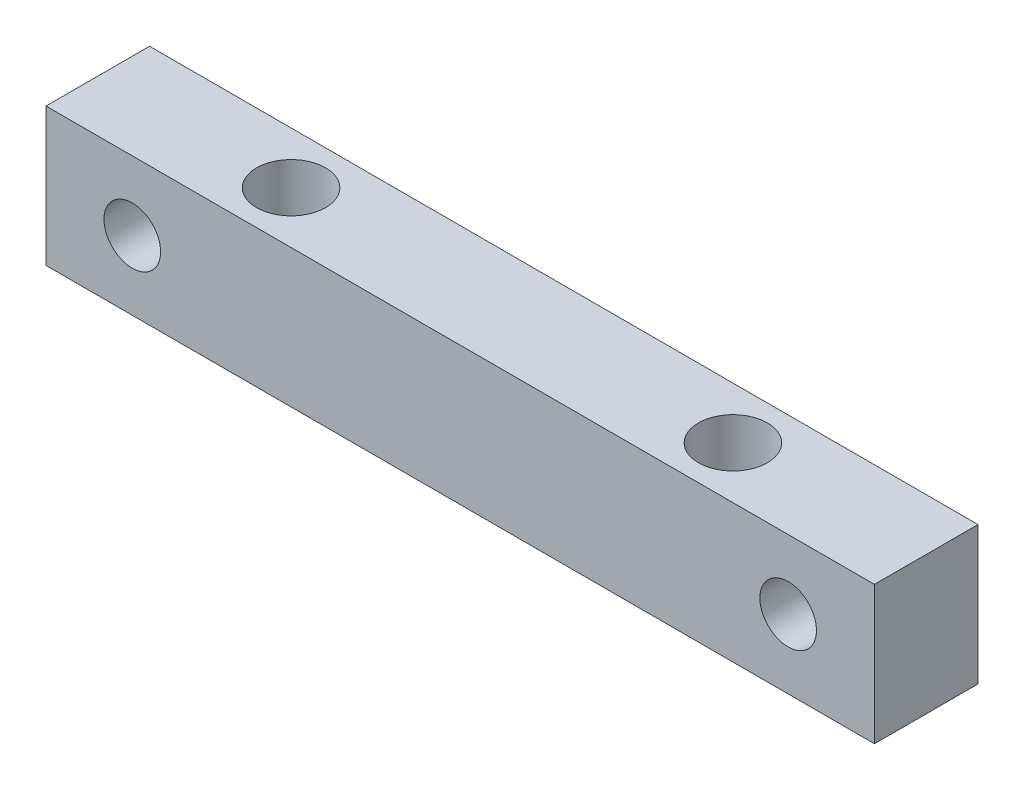
ISO-10303-21;
HEADER;
FILE_DESCRIPTION(('STEP AP214'),'2;1');
FILE_NAME('part.step','',(''),(''),'','','');
FILE_SCHEMA(('AUTOMOTIVE_DESIGN { 1 0 10303 214 1 1 1 1 }'));
ENDSEC;
DATA;
#1=APPLICATION_CONTEXT('core data for automotive mechanical design processes');
#2=APPLICATION_PROTOCOL_DEFINITION('international standard','automotive_design',2000,#1);
#3=PRODUCT_CONTEXT('',#1,'mechanical');
#4=PRODUCT('Part','Part','',(#3));
#5=PRODUCT_RELATED_PRODUCT_CATEGORY('part','',(#4));
#6=PRODUCT_DEFINITION_FORMATION('','',#4);
#7=PRODUCT_DEFINITION_CONTEXT('part definition',#1,'design');
#8=PRODUCT_DEFINITION('design','',#6,#7);
#9=PRODUCT_DEFINITION_SHAPE('','',#8);
#10=(LENGTH_UNIT() NAMED_UNIT(*) SI_UNIT(.MILLI.,.METRE.));
#11=(NAMED_UNIT(*) PLANE_ANGLE_UNIT() SI_UNIT($,.RADIAN.));
#12=(NAMED_UNIT(*) SI_UNIT($,.STERADIAN.) SOLID_ANGLE_UNIT());
#13=UNCERTAINTY_MEASURE_WITH_UNIT(LENGTH_MEASURE(1.E-05),#10,'distance_accuracy_value','');
#14=(GEOMETRIC_REPRESENTATION_CONTEXT(3) GLOBAL_UNCERTAINTY_ASSIGNED_CONTEXT((#13)) GLOBAL_UNIT_ASSIGNED_CONTEXT((#10,
#11,#12)) REPRESENTATION_CONTEXT('',''));
#15=CARTESIAN_POINT('',(0.,0.,0.));
#16=DIRECTION('',(0.,0.,1.));
#17=DIRECTION('',(1.,0.,0.));
#18=AXIS2_PLACEMENT_3D('',#15,#16,#17);
#19=CARTESIAN_POINT('',(0.,800.856140975981,0.));
#20=DIRECTION('',(0.,1.,0.));
#21=DIRECTION('',(0.,0.,1.));
#22=AXIS2_PLACEMENT_3D('',#19,#20,#21);
#23=PLANE('',#22);
#24=CARTESIAN_POINT('',(-20.3200000000132,800.856140975981,-58.7375));
#25=DIRECTION('',(0.,1.,0.));
#26=DIRECTION('',(0.,0.,1.));
#27=AXIS2_PLACEMENT_3D('',#24,#25,#26);
#28=CIRCLE('',#27,3.175);
#29=CARTESIAN_POINT('',(-20.3200000000132,800.856140975981,-55.5625));
#30=VERTEX_POINT('',#29);
#31=EDGE_CURVE('E100',#30,#30,#28,.T.);
#32=ORIENTED_EDGE('',*,*,#31,.F.);
#33=EDGE_LOOP('',(#32));
#34=FACE_BOUND('',#33,.T.);
#35=DIRECTION('',(0.,0.,1.));
#36=VECTOR('',#35,1.);
#37=CARTESIAN_POINT('',(-38.1000000000132,800.856140975981,-63.5));
#38=LINE('',#37,#36);
#39=CARTESIAN_POINT('',(-38.1000000000132,800.856140975981,-63.5));
#40=VERTEX_POINT('',#39);
#41=CARTESIAN_POINT('',(-38.1000000000132,800.856140975981,-53.975));
#42=VERTEX_POINT('',#41);
#43=EDGE_CURVE('E85',#40,#42,#38,.T.);
#44=ORIENTED_EDGE('',*,*,#43,.T.);
#45=DIRECTION('',(1.,0.,0.));
#46=VECTOR('',#45,1.);
#47=CARTESIAN_POINT('',(-38.1000000000132,800.856140975981,-53.975));
#48=LINE('',#47,#46);
#49=CARTESIAN_POINT('',(38.0999999999868,800.856140975981,-53.975));
#50=VERTEX_POINT('',#49);
#51=EDGE_CURVE('E80',#42,#50,#48,.T.);
#52=ORIENTED_EDGE('',*,*,#51,.T.);
#53=DIRECTION('',(0.,0.,-1.));
#54=VECTOR('',#53,1.);
#55=CARTESIAN_POINT('',(38.0999999999868,800.856140975981,-63.5));
#56=LINE('',#55,#54);
#57=CARTESIAN_POINT('',(38.0999999999868,800.856140975981,-63.5));
#58=VERTEX_POINT('',#57);
#59=EDGE_CURVE('E83',#50,#58,#56,.T.);
#60=ORIENTED_EDGE('',*,*,#59,.T.);
#61=DIRECTION('',(-1.,0.,0.));
#62=VECTOR('',#61,1.);
#63=CARTESIAN_POINT('',(-38.1000000000132,800.856140975981,-63.5));
#64=LINE('',#63,#62);
#65=EDGE_CURVE('E50',#58,#40,#64,.T.);
#66=ORIENTED_EDGE('',*,*,#65,.T.);
#67=EDGE_LOOP('',(#44,#52,#60,#66));
#68=FACE_BOUND('',#67,.T.);
#69=CARTESIAN_POINT('',(20.3199999999868,800.856140975981,-58.7375));
#70=DIRECTION('',(0.,1.,0.));
#71=DIRECTION('',(0.,0.,-1.));
#72=AXIS2_PLACEMENT_3D('',#69,#70,#71);
#73=CIRCLE('',#72,3.175);
#74=CARTESIAN_POINT('',(20.3199999999868,800.856140975981,-61.9125));
#75=VERTEX_POINT('',#74);
#76=EDGE_CURVE('E115',#75,#75,#73,.T.);
#77=ORIENTED_EDGE('',*,*,#76,.F.);
#78=EDGE_LOOP('',(#77));
#79=FACE_BOUND('',#78,.T.);
#80=ADVANCED_FACE('F33',(#34,#68,#79),#23,.T.);
#81=CARTESIAN_POINT('',(0.,788.156140975981,0.));
#82=DIRECTION('',(0.,1.,0.));
#83=DIRECTION('',(0.,0.,1.));
#84=AXIS2_PLACEMENT_3D('',#81,#82,#83);
#85=PLANE('',#84);
#86=DIRECTION('',(0.,0.,1.));
#87=VECTOR('',#86,1.);
#88=CARTESIAN_POINT('',(-38.1000000000132,788.156140975981,-63.5));
#89=LINE('',#88,#87);
#90=CARTESIAN_POINT('',(-38.1000000000132,788.156140975981,-63.5));
#91=VERTEX_POINT('',#90);
#92=CARTESIAN_POINT('',(-38.1000000000132,788.156140975981,-53.975));
#93=VERTEX_POINT('',#92);
#94=EDGE_CURVE('E97',#91,#93,#89,.T.);
#95=ORIENTED_EDGE('',*,*,#94,.F.);
#96=DIRECTION('',(-1.,0.,0.));
#97=VECTOR('',#96,1.);
#98=CARTESIAN_POINT('',(-38.1000000000132,788.156140975981,-63.5));
#99=LINE('',#98,#97);
#100=CARTESIAN_POINT('',(38.0999999999868,788.156140975981,-63.5));
#101=VERTEX_POINT('',#100);
#102=EDGE_CURVE('E73',#101,#91,#99,.T.);
#103=ORIENTED_EDGE('',*,*,#102,.F.);
#104=DIRECTION('',(0.,0.,-1.));
#105=VECTOR('',#104,1.);
#106=CARTESIAN_POINT('',(38.0999999999868,788.156140975981,-63.5));
#107=LINE('',#106,#105);
#108=CARTESIAN_POINT('',(38.0999999999868,788.156140975981,-53.975));
#109=VERTEX_POINT('',#108);
#110=EDGE_CURVE('E67',#109,#101,#107,.T.);
#111=ORIENTED_EDGE('',*,*,#110,.F.);
#112=DIRECTION('',(1.,0.,0.));
#113=VECTOR('',#112,1.);
#114=CARTESIAN_POINT('',(-38.1000000000132,788.156140975981,-53.975));
#115=LINE('',#114,#113);
#116=EDGE_CURVE('E89',#93,#109,#115,.T.);
#117=ORIENTED_EDGE('',*,*,#116,.F.);
#118=EDGE_LOOP('',(#95,#103,#111,#117));
#119=FACE_BOUND('',#118,.T.);
#120=CARTESIAN_POINT('',(-20.3200000000132,788.156140975981,-58.7375));
#121=DIRECTION('',(0.,1.,0.));
#122=DIRECTION('',(0.,0.,1.));
#123=AXIS2_PLACEMENT_3D('',#120,#121,#122);
#124=CIRCLE('',#123,3.175);
#125=CARTESIAN_POINT('',(-20.3200000000132,788.156140975981,-55.5625));
#126=VERTEX_POINT('',#125);
#127=EDGE_CURVE('E112',#126,#126,#124,.T.);
#128=ORIENTED_EDGE('',*,*,#127,.T.);
#129=EDGE_LOOP('',(#128));
#130=FACE_BOUND('',#129,.T.);
#131=CARTESIAN_POINT('',(20.3199999999868,788.156140975981,-58.7375));
#132=DIRECTION('',(0.,1.,0.));
#133=DIRECTION('',(0.,0.,-1.));
#134=AXIS2_PLACEMENT_3D('',#131,#132,#133);
#135=CIRCLE('',#134,3.175);
#136=CARTESIAN_POINT('',(20.3199999999868,788.156140975981,-61.9125));
#137=VERTEX_POINT('',#136);
#138=EDGE_CURVE('E118',#137,#137,#135,.T.);
#139=ORIENTED_EDGE('',*,*,#138,.T.);
#140=EDGE_LOOP('',(#139));
#141=FACE_BOUND('',#140,.T.);
#142=ADVANCED_FACE('F108',(#119,#130,#141),#85,.F.);
#143=CARTESIAN_POINT('',(-38.1000000000132,800.856140975981,-63.5));
#144=DIRECTION('',(1.,0.,0.));
#145=DIRECTION('',(0.,0.,-1.));
#146=AXIS2_PLACEMENT_3D('',#143,#144,#145);
#147=PLANE('',#146);
#148=ORIENTED_EDGE('',*,*,#94,.T.);
#149=DIRECTION('',(0.,-1.,0.));
#150=VECTOR('',#149,1.);
#151=CARTESIAN_POINT('',(-38.1000000000132,800.856140975981,-53.975));
#152=LINE('',#151,#150);
#153=EDGE_CURVE('E11',#42,#93,#152,.T.);
#154=ORIENTED_EDGE('',*,*,#153,.F.);
#155=ORIENTED_EDGE('',*,*,#43,.F.);
#156=DIRECTION('',(0.,-1.,0.));
#157=VECTOR('',#156,1.);
#158=CARTESIAN_POINT('',(-38.1000000000132,800.856140975981,-63.5));
#159=LINE('',#158,#157);
#160=EDGE_CURVE('E93',#40,#91,#159,.T.);
#161=ORIENTED_EDGE('',*,*,#160,.T.);
#162=EDGE_LOOP('',(#148,#154,#155,#161));
#163=FACE_BOUND('',#162,.T.);
#164=ADVANCED_FACE('F35',(#163),#147,.F.);
#165=CARTESIAN_POINT('',(-38.1000000000132,800.856140975981,-53.975));
#166=DIRECTION('',(0.,0.,-1.));
#167=DIRECTION('',(-1.,0.,0.));
#168=AXIS2_PLACEMENT_3D('',#165,#166,#167);
#169=PLANE('',#168);
#170=CARTESIAN_POINT('',(-30.1624999999868,794.506140975981,-53.975));
#171=DIRECTION('',(0.,0.,-1.));
#172=DIRECTION('',(-1.,0.,0.));
#173=AXIS2_PLACEMENT_3D('',#170,#171,#172);
#174=CIRCLE('',#173,2.60350000000001);
#175=CARTESIAN_POINT('',(-32.7659999999868,794.506140975981,-53.975));
#176=VERTEX_POINT('',#175);
#177=EDGE_CURVE('E121',#176,#176,#174,.F.);
#178=ORIENTED_EDGE('',*,*,#177,.F.);
#179=EDGE_LOOP('',(#178));
#180=FACE_BOUND('',#179,.T.);
#181=CARTESIAN_POINT('',(30.1624999999868,794.506140975981,-53.975));
#182=DIRECTION('',(0.,0.,-1.));
#183=DIRECTION('',(-1.,0.,0.));
#184=AXIS2_PLACEMENT_3D('',#181,#182,#183);
#185=CIRCLE('',#184,2.60350000000001);
#186=CARTESIAN_POINT('',(27.5589999999867,794.506140975981,-53.975));
#187=VERTEX_POINT('',#186);
#188=EDGE_CURVE('E124',#187,#187,#185,.F.);
#189=ORIENTED_EDGE('',*,*,#188,.F.);
#190=EDGE_LOOP('',(#189));
#191=FACE_BOUND('',#190,.T.);
#192=ORIENTED_EDGE('',*,*,#116,.T.);
#193=DIRECTION('',(0.,-1.,0.));
#194=VECTOR('',#193,1.);
#195=CARTESIAN_POINT('',(38.0999999999868,800.856140975981,-53.975));
#196=LINE('',#195,#194);
#197=EDGE_CURVE('E42',#50,#109,#196,.T.);
#198=ORIENTED_EDGE('',*,*,#197,.F.);
#199=ORIENTED_EDGE('',*,*,#51,.F.);
#200=ORIENTED_EDGE('',*,*,#153,.T.);
#201=EDGE_LOOP('',(#192,#198,#199,#200));
#202=FACE_BOUND('',#201,.T.);
#203=ADVANCED_FACE('F88',(#180,#191,#202),#169,.F.);
#204=CARTESIAN_POINT('',(38.0999999999868,800.856140975981,-63.5));
#205=DIRECTION('',(-1.,0.,0.));
#206=DIRECTION('',(0.,0.,1.));
#207=AXIS2_PLACEMENT_3D('',#204,#205,#206);
#208=PLANE('',#207);
#209=ORIENTED_EDGE('',*,*,#110,.T.);
#210=DIRECTION('',(0.,-1.,0.));
#211=VECTOR('',#210,1.);
#212=CARTESIAN_POINT('',(38.0999999999868,800.856140975981,-63.5));
#213=LINE('',#212,#211);
#214=EDGE_CURVE('E90',#58,#101,#213,.T.);
#215=ORIENTED_EDGE('',*,*,#214,.F.);
#216=ORIENTED_EDGE('',*,*,#59,.F.);
#217=ORIENTED_EDGE('',*,*,#197,.T.);
#218=EDGE_LOOP('',(#209,#215,#216,#217));
#219=FACE_BOUND('',#218,.T.);
#220=ADVANCED_FACE('F91',(#219),#208,.F.);
#221=CARTESIAN_POINT('',(-38.1000000000132,800.856140975981,-63.5));
#222=DIRECTION('',(0.,0.,1.));
#223=DIRECTION('',(1.,0.,0.));
#224=AXIS2_PLACEMENT_3D('',#221,#222,#223);
#225=PLANE('',#224);
#226=CARTESIAN_POINT('',(-30.1624999999868,794.506140975981,-63.5));
#227=DIRECTION('',(0.,0.,-1.));
#228=DIRECTION('',(-1.,0.,0.));
#229=AXIS2_PLACEMENT_3D('',#226,#227,#228);
#230=CIRCLE('',#229,2.60350000000001);
#231=CARTESIAN_POINT('',(-32.7659999999868,794.506140975981,-63.5));
#232=VERTEX_POINT('',#231);
#233=EDGE_CURVE('E127',#232,#232,#230,.T.);
#234=ORIENTED_EDGE('',*,*,#233,.F.);
#235=EDGE_LOOP('',(#234));
#236=FACE_BOUND('',#235,.T.);
#237=CARTESIAN_POINT('',(30.1624999999868,794.506140975981,-63.5));
#238=DIRECTION('',(0.,0.,-1.));
#239=DIRECTION('',(-1.,0.,0.));
#240=AXIS2_PLACEMENT_3D('',#237,#238,#239);
#241=CIRCLE('',#240,2.60350000000001);
#242=CARTESIAN_POINT('',(27.5589999999867,794.506140975981,-63.5));
#243=VERTEX_POINT('',#242);
#244=EDGE_CURVE('E128',#243,#243,#241,.T.);
#245=ORIENTED_EDGE('',*,*,#244,.F.);
#246=EDGE_LOOP('',(#245));
#247=FACE_BOUND('',#246,.T.);
#248=ORIENTED_EDGE('',*,*,#102,.T.);
#249=ORIENTED_EDGE('',*,*,#160,.F.);
#250=ORIENTED_EDGE('',*,*,#65,.F.);
#251=ORIENTED_EDGE('',*,*,#214,.T.);
#252=EDGE_LOOP('',(#248,#249,#250,#251));
#253=FACE_BOUND('',#252,.T.);
#254=ADVANCED_FACE('F105',(#236,#247,#253),#225,.F.);
#255=CARTESIAN_POINT('',(-20.3200000000132,800.856140975981,-58.7375));
#256=DIRECTION('',(0.,-1.,0.));
#257=DIRECTION('',(0.,0.,-1.));
#258=AXIS2_PLACEMENT_3D('',#255,#256,#257);
#259=CYLINDRICAL_SURFACE('',#258,3.175);
#260=ORIENTED_EDGE('',*,*,#31,.T.);
#261=EDGE_LOOP('',(#260));
#262=FACE_BOUND('',#261,.T.);
#263=ORIENTED_EDGE('',*,*,#127,.F.);
#264=EDGE_LOOP('',(#263));
#265=FACE_BOUND('',#264,.T.);
#266=ADVANCED_FACE('F141',(#262,#265),#259,.F.);
#267=CARTESIAN_POINT('',(20.3199999999868,800.856140975981,-58.7375));
#268=DIRECTION('',(0.,-1.,0.));
#269=DIRECTION('',(0.,0.,-1.));
#270=AXIS2_PLACEMENT_3D('',#267,#268,#269);
#271=CYLINDRICAL_SURFACE('',#270,3.175);
#272=ORIENTED_EDGE('',*,*,#76,.T.);
#273=EDGE_LOOP('',(#272));
#274=FACE_BOUND('',#273,.T.);
#275=ORIENTED_EDGE('',*,*,#138,.F.);
#276=EDGE_LOOP('',(#275));
#277=FACE_BOUND('',#276,.T.);
#278=ADVANCED_FACE('F148',(#274,#277),#271,.F.);
#279=CARTESIAN_POINT('',(30.1624999999868,794.506140975981,-53.974));
#280=DIRECTION('',(0.,0.,-1.));
#281=DIRECTION('',(-1.,0.,0.));
#282=AXIS2_PLACEMENT_3D('',#279,#280,#281);
#283=CYLINDRICAL_SURFACE('',#282,2.60350000000001);
#284=ORIENTED_EDGE('',*,*,#244,.T.);
#285=EDGE_LOOP('',(#284));
#286=FACE_BOUND('',#285,.T.);
#287=ORIENTED_EDGE('',*,*,#188,.T.);
#288=EDGE_LOOP('',(#287));
#289=FACE_BOUND('',#288,.T.);
#290=ADVANCED_FACE('F145',(#286,#289),#283,.F.);
#291=CARTESIAN_POINT('',(-30.1624999999868,794.506140975981,-53.974));
#292=DIRECTION('',(0.,0.,-1.));
#293=DIRECTION('',(-1.,0.,0.));
#294=AXIS2_PLACEMENT_3D('',#291,#292,#293);
#295=CYLINDRICAL_SURFACE('',#294,2.60350000000001);
#296=ORIENTED_EDGE('',*,*,#233,.T.);
#297=EDGE_LOOP('',(#296));
#298=FACE_BOUND('',#297,.T.);
#299=ORIENTED_EDGE('',*,*,#177,.T.);
#300=EDGE_LOOP('',(#299));
#301=FACE_BOUND('',#300,.T.);
#302=ADVANCED_FACE('F136',(#298,#301),#295,.F.);
#303=CLOSED_SHELL('',(#80,#142,#164,#203,#220,#254,#266,#278,#290,#302));
#304=MANIFOLD_SOLID_BREP('B2',#303);
#305=ADVANCED_BREP_SHAPE_REPRESENTATION('',(#18,#304),#14);
#306=SHAPE_DEFINITION_REPRESENTATION(#9,#305);
ENDSEC;
END-ISO-10303-21;
